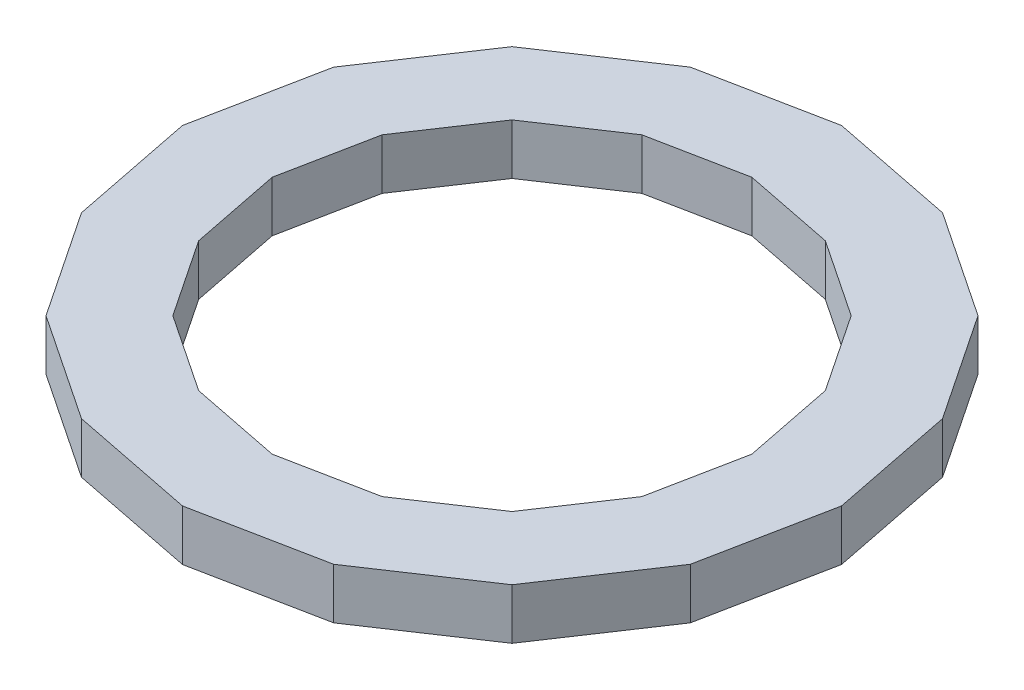
ISO-10303-21;
HEADER;
FILE_DESCRIPTION(('STEP AP214'),'2;1');
FILE_NAME('part.step','',(''),(''),'','','');
FILE_SCHEMA(('AUTOMOTIVE_DESIGN { 1 0 10303 214 1 1 1 1 }'));
ENDSEC;
DATA;
#1=APPLICATION_CONTEXT('core data for automotive mechanical design processes');
#2=APPLICATION_PROTOCOL_DEFINITION('international standard','automotive_design',2000,#1);
#3=PRODUCT_CONTEXT('',#1,'mechanical');
#4=PRODUCT('Part','Part','',(#3));
#5=PRODUCT_RELATED_PRODUCT_CATEGORY('part','',(#4));
#6=PRODUCT_DEFINITION_FORMATION('','',#4);
#7=PRODUCT_DEFINITION_CONTEXT('part definition',#1,'design');
#8=PRODUCT_DEFINITION('design','',#6,#7);
#9=PRODUCT_DEFINITION_SHAPE('','',#8);
#10=(LENGTH_UNIT() NAMED_UNIT(*) SI_UNIT(.MILLI.,.METRE.));
#11=(NAMED_UNIT(*) PLANE_ANGLE_UNIT() SI_UNIT($,.RADIAN.));
#12=(NAMED_UNIT(*) SI_UNIT($,.STERADIAN.) SOLID_ANGLE_UNIT());
#13=UNCERTAINTY_MEASURE_WITH_UNIT(LENGTH_MEASURE(1.E-05),#10,'distance_accuracy_value','');
#14=(GEOMETRIC_REPRESENTATION_CONTEXT(3) GLOBAL_UNCERTAINTY_ASSIGNED_CONTEXT((#13)) GLOBAL_UNIT_ASSIGNED_CONTEXT((#10,
#11,#12)) REPRESENTATION_CONTEXT('',''));
#15=CARTESIAN_POINT('',(0.,0.,0.));
#16=DIRECTION('',(0.,0.,1.));
#17=DIRECTION('',(1.,0.,0.));
#18=AXIS2_PLACEMENT_3D('',#15,#16,#17);
#19=CARTESIAN_POINT('',(0.,19.05,0.));
#20=DIRECTION('',(0.,1.,0.));
#21=DIRECTION('',(0.,0.,1.));
#22=AXIS2_PLACEMENT_3D('',#19,#20,#21);
#23=PLANE('',#22);
#24=DIRECTION('',(0.195090322016118,0.,-0.980785280403232));
#25=VECTOR('',#24,1.);
#26=CARTESIAN_POINT('',(114.271240567507,19.05,47.3326976322586));
#27=LINE('',#26,#25);
#28=CARTESIAN_POINT('',(114.271240567507,19.05,47.3326976322586));
#29=VERTEX_POINT('',#28);
#30=CARTESIAN_POINT('',(123.686299508005,19.05,-1.40512344733112E-12));
#31=VERTEX_POINT('',#30);
#32=EDGE_CURVE('E370',#29,#31,#27,.T.);
#33=ORIENTED_EDGE('',*,*,#32,.T.);
#34=DIRECTION('',(-0.195090322016139,0.,-0.980785280403228));
#35=VECTOR('',#34,1.);
#36=CARTESIAN_POINT('',(123.686299508005,19.05,-1.40512344733112E-12));
#37=LINE('',#36,#35);
#38=CARTESIAN_POINT('',(114.271240567506,19.05,-47.3326976322612));
#39=VERTEX_POINT('',#38);
#40=EDGE_CURVE('E373',#31,#39,#37,.T.);
#41=ORIENTED_EDGE('',*,*,#40,.T.);
#42=DIRECTION('',(-0.555570233019612,0.,-0.831469612302539));
#43=VECTOR('',#42,1.);
#44=CARTESIAN_POINT('',(114.271240567506,19.05,-47.3326976322612));
#45=LINE('',#44,#43);
#46=CARTESIAN_POINT('',(87.4594211219797,19.05,-87.4594211219817));
#47=VERTEX_POINT('',#46);
#48=EDGE_CURVE('E376',#39,#47,#45,.T.);
#49=ORIENTED_EDGE('',*,*,#48,.T.);
#50=DIRECTION('',(-0.831469612302551,0.,-0.555570233019593));
#51=VECTOR('',#50,1.);
#52=CARTESIAN_POINT('',(87.4594211219797,19.05,-87.4594211219817));
#53=LINE('',#52,#51);
#54=CARTESIAN_POINT('',(47.3326976322587,19.05,-114.271240567507));
#55=VERTEX_POINT('',#54);
#56=EDGE_CURVE('E378',#47,#55,#53,.T.);
#57=ORIENTED_EDGE('',*,*,#56,.T.);
#58=DIRECTION('',(-0.980785280403233,0.,-0.195090322016117));
#59=VECTOR('',#58,1.);
#60=CARTESIAN_POINT('',(47.3326976322587,19.05,-114.271240567507));
#61=LINE('',#60,#59);
#62=CARTESIAN_POINT('',(-1.45019229977314E-12,19.05,-123.686299508005));
#63=VERTEX_POINT('',#62);
#64=EDGE_CURVE('E380',#55,#63,#61,.T.);
#65=ORIENTED_EDGE('',*,*,#64,.T.);
#66=DIRECTION('',(-0.980785280403228,0.,0.195090322016139));
#67=VECTOR('',#66,1.);
#68=CARTESIAN_POINT('',(-1.45019229977314E-12,19.05,-123.686299508005));
#69=LINE('',#68,#67);
#70=CARTESIAN_POINT('',(-47.3326976322612,19.05,-114.271240567506));
#71=VERTEX_POINT('',#70);
#72=EDGE_CURVE('E382',#63,#71,#69,.T.);
#73=ORIENTED_EDGE('',*,*,#72,.T.);
#74=DIRECTION('',(-0.831469612302539,0.,0.555570233019612));
#75=VECTOR('',#74,1.);
#76=CARTESIAN_POINT('',(-47.3326976322612,19.05,-114.271240567506));
#77=LINE('',#76,#75);
#78=CARTESIAN_POINT('',(-87.4594211219816,19.05,-87.4594211219796));
#79=VERTEX_POINT('',#78);
#80=EDGE_CURVE('E384',#71,#79,#77,.T.);
#81=ORIENTED_EDGE('',*,*,#80,.T.);
#82=DIRECTION('',(-0.555570233019593,0.,0.831469612302551));
#83=VECTOR('',#82,1.);
#84=CARTESIAN_POINT('',(-87.4594211219816,19.05,-87.4594211219796));
#85=LINE('',#84,#83);
#86=CARTESIAN_POINT('',(-114.271240567507,19.05,-47.3326976322586));
#87=VERTEX_POINT('',#86);
#88=EDGE_CURVE('E386',#79,#87,#85,.T.);
#89=ORIENTED_EDGE('',*,*,#88,.T.);
#90=DIRECTION('',(-0.195090322016117,0.,0.980785280403233));
#91=VECTOR('',#90,1.);
#92=CARTESIAN_POINT('',(-114.271240567507,19.05,-47.3326976322586));
#93=LINE('',#92,#91);
#94=CARTESIAN_POINT('',(-123.686299508005,19.05,1.43584065974332E-12));
#95=VERTEX_POINT('',#94);
#96=EDGE_CURVE('E389',#87,#95,#93,.T.);
#97=ORIENTED_EDGE('',*,*,#96,.T.);
#98=DIRECTION('',(0.195090322016139,0.,0.980785280403228));
#99=VECTOR('',#98,1.);
#100=CARTESIAN_POINT('',(-123.686299508005,19.05,1.43584065974332E-12));
#101=LINE('',#100,#99);
#102=CARTESIAN_POINT('',(-114.271240567506,19.05,47.3326976322612));
#103=VERTEX_POINT('',#102);
#104=EDGE_CURVE('E391',#95,#103,#101,.T.);
#105=ORIENTED_EDGE('',*,*,#104,.T.);
#106=DIRECTION('',(0.555570233019612,0.,0.831469612302539));
#107=VECTOR('',#106,1.);
#108=CARTESIAN_POINT('',(-114.271240567506,19.05,47.3326976322612));
#109=LINE('',#108,#107);
#110=CARTESIAN_POINT('',(-87.4594211219797,19.05,87.4594211219816));
#111=VERTEX_POINT('',#110);
#112=EDGE_CURVE('E393',#103,#111,#109,.T.);
#113=ORIENTED_EDGE('',*,*,#112,.T.);
#114=DIRECTION('',(0.831469612302552,0.,0.555570233019593));
#115=VECTOR('',#114,1.);
#116=CARTESIAN_POINT('',(-87.4594211219797,19.05,87.4594211219816));
#117=LINE('',#116,#115);
#118=CARTESIAN_POINT('',(-47.3326976322585,19.05,114.271240567507));
#119=VERTEX_POINT('',#118);
#120=EDGE_CURVE('E396',#111,#119,#117,.T.);
#121=ORIENTED_EDGE('',*,*,#120,.T.);
#122=DIRECTION('',(0.980785280403233,0.,0.195090322016117));
#123=VECTOR('',#122,1.);
#124=CARTESIAN_POINT('',(-47.3326976322585,19.05,114.271240567507));
#125=LINE('',#124,#123);
#126=CARTESIAN_POINT('',(1.37953051063682E-12,19.05,123.686299508005));
#127=VERTEX_POINT('',#126);
#128=EDGE_CURVE('E399',#119,#127,#125,.T.);
#129=ORIENTED_EDGE('',*,*,#128,.T.);
#130=DIRECTION('',(0.980785280403228,0.,-0.195090322016139));
#131=VECTOR('',#130,1.);
#132=CARTESIAN_POINT('',(1.37953051063682E-12,19.05,123.686299508005));
#133=LINE('',#132,#131);
#134=CARTESIAN_POINT('',(47.3326976322611,19.05,114.271240567506));
#135=VERTEX_POINT('',#134);
#136=EDGE_CURVE('E401',#127,#135,#133,.T.);
#137=ORIENTED_EDGE('',*,*,#136,.T.);
#138=DIRECTION('',(0.831469612302539,0.,-0.555570233019612));
#139=VECTOR('',#138,1.);
#140=CARTESIAN_POINT('',(47.3326976322611,19.05,114.271240567506));
#141=LINE('',#140,#139);
#142=CARTESIAN_POINT('',(87.4594211219816,19.05,87.4594211219797));
#143=VERTEX_POINT('',#142);
#144=EDGE_CURVE('E404',#135,#143,#141,.T.);
#145=ORIENTED_EDGE('',*,*,#144,.T.);
#146=DIRECTION('',(0.555570233019593,0.,-0.831469612302551));
#147=VECTOR('',#146,1.);
#148=CARTESIAN_POINT('',(87.4594211219816,19.05,87.4594211219797));
#149=LINE('',#148,#147);
#150=EDGE_CURVE('E407',#143,#29,#149,.T.);
#151=ORIENTED_EDGE('',*,*,#150,.T.);
#152=EDGE_LOOP('',(#33,#41,#49,#57,#65,#73,#81,#89,#97,#105,#113,#121,#129,#137,#145,#151));
#153=FACE_BOUND('',#152,.T.);
#154=DIRECTION('',(-0.195090322016139,0.,-0.980785280403228));
#155=VECTOR('',#154,1.);
#156=CARTESIAN_POINT('',(90.0193994639663,19.05,-1.03392254762578E-12));
#157=LINE('',#156,#155);
#158=CARTESIAN_POINT('',(90.0193994639663,19.05,-1.03392254762578E-12));
#159=VERTEX_POINT('',#158);
#160=CARTESIAN_POINT('',(83.1670806937156,19.05,-34.4489327663157));
#161=VERTEX_POINT('',#160);
#162=EDGE_CURVE('E252',#159,#161,#157,.T.);
#163=ORIENTED_EDGE('',*,*,#162,.F.);
#164=DIRECTION('',(0.195090322016117,0.,-0.980785280403233));
#165=VECTOR('',#164,1.);
#166=CARTESIAN_POINT('',(83.1670806937164,19.05,34.4489327663138));
#167=LINE('',#166,#165);
#168=CARTESIAN_POINT('',(83.1670806937164,19.05,34.4489327663138));
#169=VERTEX_POINT('',#168);
#170=EDGE_CURVE('E243',#169,#159,#167,.T.);
#171=ORIENTED_EDGE('',*,*,#170,.F.);
#172=DIRECTION('',(0.555570233019593,0.,-0.831469612302552));
#173=VECTOR('',#172,1.);
#174=CARTESIAN_POINT('',(63.653327799312,19.05,63.6533277993105));
#175=LINE('',#174,#173);
#176=CARTESIAN_POINT('',(63.653327799312,19.05,63.6533277993105));
#177=VERTEX_POINT('',#176);
#178=EDGE_CURVE('E295',#177,#169,#175,.T.);
#179=ORIENTED_EDGE('',*,*,#178,.F.);
#180=DIRECTION('',(0.831469612302539,0.,-0.555570233019612));
#181=VECTOR('',#180,1.);
#182=CARTESIAN_POINT('',(34.4489327663157,19.05,83.1670806937156));
#183=LINE('',#182,#181);
#184=CARTESIAN_POINT('',(34.4489327663157,19.05,83.1670806937156));
#185=VERTEX_POINT('',#184);
#186=EDGE_CURVE('E293',#185,#177,#183,.T.);
#187=ORIENTED_EDGE('',*,*,#186,.F.);
#188=DIRECTION('',(0.980785280403228,0.,-0.19509032201614));
#189=VECTOR('',#188,1.);
#190=CARTESIAN_POINT('',(9.94426697695727E-13,19.05,90.0193994639663));
#191=LINE('',#190,#189);
#192=CARTESIAN_POINT('',(9.94426697695727E-13,19.05,90.0193994639663));
#193=VERTEX_POINT('',#192);
#194=EDGE_CURVE('E291',#193,#185,#191,.T.);
#195=ORIENTED_EDGE('',*,*,#194,.F.);
#196=DIRECTION('',(0.980785280403233,0.,0.195090322016117));
#197=VECTOR('',#196,1.);
#198=CARTESIAN_POINT('',(-34.4489327663138,19.05,83.1670806937164));
#199=LINE('',#198,#197);
#200=CARTESIAN_POINT('',(-34.4489327663138,19.05,83.1670806937164));
#201=VERTEX_POINT('',#200);
#202=EDGE_CURVE('E289',#201,#193,#199,.T.);
#203=ORIENTED_EDGE('',*,*,#202,.F.);
#204=DIRECTION('',(0.831469612302551,0.,0.555570233019593));
#205=VECTOR('',#204,1.);
#206=CARTESIAN_POINT('',(-63.6533277993105,19.05,63.653327799312));
#207=LINE('',#206,#205);
#208=CARTESIAN_POINT('',(-63.6533277993105,19.05,63.653327799312));
#209=VERTEX_POINT('',#208);
#210=EDGE_CURVE('E287',#209,#201,#207,.T.);
#211=ORIENTED_EDGE('',*,*,#210,.F.);
#212=DIRECTION('',(0.555570233019612,0.,0.831469612302539));
#213=VECTOR('',#212,1.);
#214=CARTESIAN_POINT('',(-83.1670806937156,19.05,34.4489327663157));
#215=LINE('',#214,#213);
#216=CARTESIAN_POINT('',(-83.1670806937156,19.05,34.4489327663157));
#217=VERTEX_POINT('',#216);
#218=EDGE_CURVE('E285',#217,#209,#215,.T.);
#219=ORIENTED_EDGE('',*,*,#218,.F.);
#220=DIRECTION('',(0.195090322016139,0.,0.980785280403228));
#221=VECTOR('',#220,1.);
#222=CARTESIAN_POINT('',(-90.0193994639663,19.05,1.01994808380553E-12));
#223=LINE('',#222,#221);
#224=CARTESIAN_POINT('',(-90.0193994639663,19.05,1.01994808380553E-12));
#225=VERTEX_POINT('',#224);
#226=EDGE_CURVE('E283',#225,#217,#223,.T.);
#227=ORIENTED_EDGE('',*,*,#226,.F.);
#228=DIRECTION('',(-0.195090322016117,0.,0.980785280403233));
#229=VECTOR('',#228,1.);
#230=CARTESIAN_POINT('',(-83.1670806937164,19.05,-34.4489327663138));
#231=LINE('',#230,#229);
#232=CARTESIAN_POINT('',(-83.1670806937164,19.05,-34.4489327663138));
#233=VERTEX_POINT('',#232);
#234=EDGE_CURVE('E280',#233,#225,#231,.T.);
#235=ORIENTED_EDGE('',*,*,#234,.F.);
#236=DIRECTION('',(-0.555570233019592,0.,0.831469612302552));
#237=VECTOR('',#236,1.);
#238=CARTESIAN_POINT('',(-63.653327799312,19.05,-63.6533277993105));
#239=LINE('',#238,#237);
#240=CARTESIAN_POINT('',(-63.653327799312,19.05,-63.6533277993105));
#241=VERTEX_POINT('',#240);
#242=EDGE_CURVE('E277',#241,#233,#239,.T.);
#243=ORIENTED_EDGE('',*,*,#242,.F.);
#244=DIRECTION('',(-0.831469612302539,0.,0.555570233019612));
#245=VECTOR('',#244,1.);
#246=CARTESIAN_POINT('',(-34.4489327663157,19.05,-83.1670806937156));
#247=LINE('',#246,#245);
#248=CARTESIAN_POINT('',(-34.4489327663157,19.05,-83.1670806937156));
#249=VERTEX_POINT('',#248);
#250=EDGE_CURVE('E275',#249,#241,#247,.T.);
#251=ORIENTED_EDGE('',*,*,#250,.F.);
#252=DIRECTION('',(-0.980785280403228,0.,0.19509032201614));
#253=VECTOR('',#252,1.);
#254=CARTESIAN_POINT('',(-1.08225444788511E-12,19.05,-90.0193994639663));
#255=LINE('',#254,#253);
#256=CARTESIAN_POINT('',(-1.08225444788511E-12,19.05,-90.0193994639663));
#257=VERTEX_POINT('',#256);
#258=EDGE_CURVE('E273',#257,#249,#255,.T.);
#259=ORIENTED_EDGE('',*,*,#258,.F.);
#260=DIRECTION('',(-0.980785280403233,0.,-0.195090322016117));
#261=VECTOR('',#260,1.);
#262=CARTESIAN_POINT('',(34.4489327663137,19.05,-83.1670806937164));
#263=LINE('',#262,#261);
#264=CARTESIAN_POINT('',(34.4489327663137,19.05,-83.1670806937164));
#265=VERTEX_POINT('',#264);
#266=EDGE_CURVE('E271',#265,#257,#263,.T.);
#267=ORIENTED_EDGE('',*,*,#266,.F.);
#268=DIRECTION('',(-0.831469612302552,0.,-0.555570233019593));
#269=VECTOR('',#268,1.);
#270=CARTESIAN_POINT('',(63.6533277993105,19.05,-63.6533277993119));
#271=LINE('',#270,#269);
#272=CARTESIAN_POINT('',(63.6533277993105,19.05,-63.6533277993119));
#273=VERTEX_POINT('',#272);
#274=EDGE_CURVE('E267',#273,#265,#271,.T.);
#275=ORIENTED_EDGE('',*,*,#274,.F.);
#276=DIRECTION('',(-0.555570233019612,0.,-0.831469612302538));
#277=VECTOR('',#276,1.);
#278=CARTESIAN_POINT('',(83.1670806937156,19.05,-34.4489327663157));
#279=LINE('',#278,#277);
#280=EDGE_CURVE('E265',#161,#273,#279,.T.);
#281=ORIENTED_EDGE('',*,*,#280,.F.);
#282=EDGE_LOOP('',(#163,#171,#179,#187,#195,#203,#211,#219,#227,#235,#243,#251,#259,#267,#275,#281));
#283=FACE_BOUND('',#282,.T.);
#284=ADVANCED_FACE('F34',(#153,#283),#23,.T.);
#285=CARTESIAN_POINT('',(0.,0.,0.));
#286=DIRECTION('',(0.,1.,0.));
#287=DIRECTION('',(0.,0.,1.));
#288=AXIS2_PLACEMENT_3D('',#285,#286,#287);
#289=PLANE('',#288);
#290=DIRECTION('',(0.195090322016118,0.,-0.980785280403232));
#291=VECTOR('',#290,1.);
#292=CARTESIAN_POINT('',(114.271240567507,0.,47.3326976322586));
#293=LINE('',#292,#291);
#294=CARTESIAN_POINT('',(114.271240567507,0.,47.3326976322586));
#295=VERTEX_POINT('',#294);
#296=CARTESIAN_POINT('',(123.686299508005,0.,-1.40512344733112E-12));
#297=VERTEX_POINT('',#296);
#298=EDGE_CURVE('E260',#295,#297,#293,.T.);
#299=ORIENTED_EDGE('',*,*,#298,.F.);
#300=DIRECTION('',(0.555570233019593,0.,-0.831469612302551));
#301=VECTOR('',#300,1.);
#302=CARTESIAN_POINT('',(87.4594211219816,0.,87.4594211219797));
#303=LINE('',#302,#301);
#304=CARTESIAN_POINT('',(87.4594211219816,0.,87.4594211219797));
#305=VERTEX_POINT('',#304);
#306=EDGE_CURVE('E374',#305,#295,#303,.T.);
#307=ORIENTED_EDGE('',*,*,#306,.F.);
#308=DIRECTION('',(0.831469612302539,0.,-0.555570233019612));
#309=VECTOR('',#308,1.);
#310=CARTESIAN_POINT('',(47.3326976322611,0.,114.271240567506));
#311=LINE('',#310,#309);
#312=CARTESIAN_POINT('',(47.3326976322611,0.,114.271240567506));
#313=VERTEX_POINT('',#312);
#314=EDGE_CURVE('E443',#313,#305,#311,.T.);
#315=ORIENTED_EDGE('',*,*,#314,.F.);
#316=DIRECTION('',(0.980785280403228,0.,-0.195090322016139));
#317=VECTOR('',#316,1.);
#318=CARTESIAN_POINT('',(1.37953051063682E-12,0.,123.686299508005));
#319=LINE('',#318,#317);
#320=CARTESIAN_POINT('',(1.37953051063682E-12,0.,123.686299508005));
#321=VERTEX_POINT('',#320);
#322=EDGE_CURVE('E440',#321,#313,#319,.T.);
#323=ORIENTED_EDGE('',*,*,#322,.F.);
#324=DIRECTION('',(0.980785280403233,0.,0.195090322016117));
#325=VECTOR('',#324,1.);
#326=CARTESIAN_POINT('',(-47.3326976322585,0.,114.271240567507));
#327=LINE('',#326,#325);
#328=CARTESIAN_POINT('',(-47.3326976322585,0.,114.271240567507));
#329=VERTEX_POINT('',#328);
#330=EDGE_CURVE('E437',#329,#321,#327,.T.);
#331=ORIENTED_EDGE('',*,*,#330,.F.);
#332=DIRECTION('',(0.831469612302552,0.,0.555570233019593));
#333=VECTOR('',#332,1.);
#334=CARTESIAN_POINT('',(-87.4594211219797,0.,87.4594211219816));
#335=LINE('',#334,#333);
#336=CARTESIAN_POINT('',(-87.4594211219797,0.,87.4594211219816));
#337=VERTEX_POINT('',#336);
#338=EDGE_CURVE('E434',#337,#329,#335,.T.);
#339=ORIENTED_EDGE('',*,*,#338,.F.);
#340=DIRECTION('',(0.555570233019612,0.,0.831469612302539));
#341=VECTOR('',#340,1.);
#342=CARTESIAN_POINT('',(-114.271240567506,0.,47.3326976322612));
#343=LINE('',#342,#341);
#344=CARTESIAN_POINT('',(-114.271240567506,0.,47.3326976322612));
#345=VERTEX_POINT('',#344);
#346=EDGE_CURVE('E431',#345,#337,#343,.T.);
#347=ORIENTED_EDGE('',*,*,#346,.F.);
#348=DIRECTION('',(0.195090322016139,0.,0.980785280403228));
#349=VECTOR('',#348,1.);
#350=CARTESIAN_POINT('',(-123.686299508005,0.,1.43584065974332E-12));
#351=LINE('',#350,#349);
#352=CARTESIAN_POINT('',(-123.686299508005,0.,1.43584065974332E-12));
#353=VERTEX_POINT('',#352);
#354=EDGE_CURVE('E428',#353,#345,#351,.T.);
#355=ORIENTED_EDGE('',*,*,#354,.F.);
#356=DIRECTION('',(-0.195090322016117,0.,0.980785280403233));
#357=VECTOR('',#356,1.);
#358=CARTESIAN_POINT('',(-114.271240567507,0.,-47.3326976322586));
#359=LINE('',#358,#357);
#360=CARTESIAN_POINT('',(-114.271240567507,0.,-47.3326976322586));
#361=VERTEX_POINT('',#360);
#362=EDGE_CURVE('E426',#361,#353,#359,.T.);
#363=ORIENTED_EDGE('',*,*,#362,.F.);
#364=DIRECTION('',(-0.555570233019593,0.,0.831469612302551));
#365=VECTOR('',#364,1.);
#366=CARTESIAN_POINT('',(-87.4594211219816,0.,-87.4594211219796));
#367=LINE('',#366,#365);
#368=CARTESIAN_POINT('',(-87.4594211219816,0.,-87.4594211219796));
#369=VERTEX_POINT('',#368);
#370=EDGE_CURVE('E424',#369,#361,#367,.T.);
#371=ORIENTED_EDGE('',*,*,#370,.F.);
#372=DIRECTION('',(-0.831469612302539,0.,0.555570233019612));
#373=VECTOR('',#372,1.);
#374=CARTESIAN_POINT('',(-47.3326976322612,0.,-114.271240567506));
#375=LINE('',#374,#373);
#376=CARTESIAN_POINT('',(-47.3326976322612,0.,-114.271240567506));
#377=VERTEX_POINT('',#376);
#378=EDGE_CURVE('E422',#377,#369,#375,.T.);
#379=ORIENTED_EDGE('',*,*,#378,.F.);
#380=DIRECTION('',(-0.980785280403228,0.,0.195090322016139));
#381=VECTOR('',#380,1.);
#382=CARTESIAN_POINT('',(-1.45019229977314E-12,0.,-123.686299508005));
#383=LINE('',#382,#381);
#384=CARTESIAN_POINT('',(-1.45019229977314E-12,0.,-123.686299508005));
#385=VERTEX_POINT('',#384);
#386=EDGE_CURVE('E420',#385,#377,#383,.T.);
#387=ORIENTED_EDGE('',*,*,#386,.F.);
#388=DIRECTION('',(-0.980785280403233,0.,-0.195090322016117));
#389=VECTOR('',#388,1.);
#390=CARTESIAN_POINT('',(47.3326976322587,0.,-114.271240567507));
#391=LINE('',#390,#389);
#392=CARTESIAN_POINT('',(47.3326976322587,0.,-114.271240567507));
#393=VERTEX_POINT('',#392);
#394=EDGE_CURVE('E418',#393,#385,#391,.T.);
#395=ORIENTED_EDGE('',*,*,#394,.F.);
#396=DIRECTION('',(-0.831469612302551,0.,-0.555570233019593));
#397=VECTOR('',#396,1.);
#398=CARTESIAN_POINT('',(87.4594211219797,0.,-87.4594211219817));
#399=LINE('',#398,#397);
#400=CARTESIAN_POINT('',(87.4594211219797,0.,-87.4594211219817));
#401=VERTEX_POINT('',#400);
#402=EDGE_CURVE('E416',#401,#393,#399,.T.);
#403=ORIENTED_EDGE('',*,*,#402,.F.);
#404=DIRECTION('',(-0.555570233019612,0.,-0.831469612302539));
#405=VECTOR('',#404,1.);
#406=CARTESIAN_POINT('',(114.271240567506,0.,-47.3326976322612));
#407=LINE('',#406,#405);
#408=CARTESIAN_POINT('',(114.271240567506,0.,-47.3326976322612));
#409=VERTEX_POINT('',#408);
#410=EDGE_CURVE('E414',#409,#401,#407,.T.);
#411=ORIENTED_EDGE('',*,*,#410,.F.);
#412=DIRECTION('',(-0.195090322016139,0.,-0.980785280403228));
#413=VECTOR('',#412,1.);
#414=CARTESIAN_POINT('',(123.686299508005,0.,-1.40512344733112E-12));
#415=LINE('',#414,#413);
#416=EDGE_CURVE('E412',#297,#409,#415,.T.);
#417=ORIENTED_EDGE('',*,*,#416,.F.);
#418=EDGE_LOOP('',(#299,#307,#315,#323,#331,#339,#347,#355,#363,#371,#379,#387,#395,#403,#411,#417));
#419=FACE_BOUND('',#418,.T.);
#420=DIRECTION('',(0.195090322016117,0.,-0.980785280403233));
#421=VECTOR('',#420,1.);
#422=CARTESIAN_POINT('',(83.1670806937164,0.,34.4489327663138));
#423=LINE('',#422,#421);
#424=CARTESIAN_POINT('',(83.1670806937164,0.,34.4489327663138));
#425=VERTEX_POINT('',#424);
#426=CARTESIAN_POINT('',(90.0193994639663,0.,-1.03392254762578E-12));
#427=VERTEX_POINT('',#426);
#428=EDGE_CURVE('E57',#425,#427,#423,.T.);
#429=ORIENTED_EDGE('',*,*,#428,.T.);
#430=DIRECTION('',(-0.195090322016139,0.,-0.980785280403228));
#431=VECTOR('',#430,1.);
#432=CARTESIAN_POINT('',(90.0193994639663,0.,-1.03392254762578E-12));
#433=LINE('',#432,#431);
#434=CARTESIAN_POINT('',(83.1670806937156,0.,-34.4489327663157));
#435=VERTEX_POINT('',#434);
#436=EDGE_CURVE('E259',#427,#435,#433,.T.);
#437=ORIENTED_EDGE('',*,*,#436,.T.);
#438=DIRECTION('',(-0.555570233019612,0.,-0.831469612302538));
#439=VECTOR('',#438,1.);
#440=CARTESIAN_POINT('',(83.1670806937156,0.,-34.4489327663157));
#441=LINE('',#440,#439);
#442=CARTESIAN_POINT('',(63.6533277993105,0.,-63.6533277993119));
#443=VERTEX_POINT('',#442);
#444=EDGE_CURVE('E299',#435,#443,#441,.T.);
#445=ORIENTED_EDGE('',*,*,#444,.T.);
#446=DIRECTION('',(-0.831469612302552,0.,-0.555570233019593));
#447=VECTOR('',#446,1.);
#448=CARTESIAN_POINT('',(63.6533277993105,0.,-63.6533277993119));
#449=LINE('',#448,#447);
#450=CARTESIAN_POINT('',(34.4489327663137,0.,-83.1670806937164));
#451=VERTEX_POINT('',#450);
#452=EDGE_CURVE('E302',#443,#451,#449,.T.);
#453=ORIENTED_EDGE('',*,*,#452,.T.);
#454=DIRECTION('',(-0.980785280403233,0.,-0.195090322016117));
#455=VECTOR('',#454,1.);
#456=CARTESIAN_POINT('',(34.4489327663137,0.,-83.1670806937164));
#457=LINE('',#456,#455);
#458=CARTESIAN_POINT('',(-1.08225444788511E-12,0.,-90.0193994639663));
#459=VERTEX_POINT('',#458);
#460=EDGE_CURVE('E305',#451,#459,#457,.T.);
#461=ORIENTED_EDGE('',*,*,#460,.T.);
#462=DIRECTION('',(-0.980785280403228,0.,0.19509032201614));
#463=VECTOR('',#462,1.);
#464=CARTESIAN_POINT('',(-1.08225444788511E-12,0.,-90.0193994639663));
#465=LINE('',#464,#463);
#466=CARTESIAN_POINT('',(-34.4489327663157,0.,-83.1670806937156));
#467=VERTEX_POINT('',#466);
#468=EDGE_CURVE('E308',#459,#467,#465,.T.);
#469=ORIENTED_EDGE('',*,*,#468,.T.);
#470=DIRECTION('',(-0.831469612302539,0.,0.555570233019612));
#471=VECTOR('',#470,1.);
#472=CARTESIAN_POINT('',(-34.4489327663157,0.,-83.1670806937156));
#473=LINE('',#472,#471);
#474=CARTESIAN_POINT('',(-63.653327799312,0.,-63.6533277993105));
#475=VERTEX_POINT('',#474);
#476=EDGE_CURVE('E311',#467,#475,#473,.T.);
#477=ORIENTED_EDGE('',*,*,#476,.T.);
#478=DIRECTION('',(-0.555570233019592,0.,0.831469612302552));
#479=VECTOR('',#478,1.);
#480=CARTESIAN_POINT('',(-63.653327799312,0.,-63.6533277993105));
#481=LINE('',#480,#479);
#482=CARTESIAN_POINT('',(-83.1670806937164,0.,-34.4489327663138));
#483=VERTEX_POINT('',#482);
#484=EDGE_CURVE('E314',#475,#483,#481,.T.);
#485=ORIENTED_EDGE('',*,*,#484,.T.);
#486=DIRECTION('',(-0.195090322016117,0.,0.980785280403233));
#487=VECTOR('',#486,1.);
#488=CARTESIAN_POINT('',(-83.1670806937164,0.,-34.4489327663138));
#489=LINE('',#488,#487);
#490=CARTESIAN_POINT('',(-90.0193994639663,0.,1.01994808380553E-12));
#491=VERTEX_POINT('',#490);
#492=EDGE_CURVE('E317',#483,#491,#489,.T.);
#493=ORIENTED_EDGE('',*,*,#492,.T.);
#494=DIRECTION('',(0.195090322016139,0.,0.980785280403228));
#495=VECTOR('',#494,1.);
#496=CARTESIAN_POINT('',(-90.0193994639663,0.,1.01994808380553E-12));
#497=LINE('',#496,#495);
#498=CARTESIAN_POINT('',(-83.1670806937156,0.,34.4489327663157));
#499=VERTEX_POINT('',#498);
#500=EDGE_CURVE('E321',#491,#499,#497,.T.);
#501=ORIENTED_EDGE('',*,*,#500,.T.);
#502=DIRECTION('',(0.555570233019612,0.,0.831469612302539));
#503=VECTOR('',#502,1.);
#504=CARTESIAN_POINT('',(-83.1670806937156,0.,34.4489327663157));
#505=LINE('',#504,#503);
#506=CARTESIAN_POINT('',(-63.6533277993105,0.,63.653327799312));
#507=VERTEX_POINT('',#506);
#508=EDGE_CURVE('E324',#499,#507,#505,.T.);
#509=ORIENTED_EDGE('',*,*,#508,.T.);
#510=DIRECTION('',(0.831469612302551,0.,0.555570233019593));
#511=VECTOR('',#510,1.);
#512=CARTESIAN_POINT('',(-63.6533277993105,0.,63.653327799312));
#513=LINE('',#512,#511);
#514=CARTESIAN_POINT('',(-34.4489327663138,0.,83.1670806937164));
#515=VERTEX_POINT('',#514);
#516=EDGE_CURVE('E327',#507,#515,#513,.T.);
#517=ORIENTED_EDGE('',*,*,#516,.T.);
#518=DIRECTION('',(0.980785280403233,0.,0.195090322016117));
#519=VECTOR('',#518,1.);
#520=CARTESIAN_POINT('',(-34.4489327663138,0.,83.1670806937164));
#521=LINE('',#520,#519);
#522=CARTESIAN_POINT('',(9.94426697695727E-13,0.,90.0193994639663));
#523=VERTEX_POINT('',#522);
#524=EDGE_CURVE('E330',#515,#523,#521,.T.);
#525=ORIENTED_EDGE('',*,*,#524,.T.);
#526=DIRECTION('',(0.980785280403228,0.,-0.19509032201614));
#527=VECTOR('',#526,1.);
#528=CARTESIAN_POINT('',(9.94426697695727E-13,0.,90.0193994639663));
#529=LINE('',#528,#527);
#530=CARTESIAN_POINT('',(34.4489327663157,0.,83.1670806937156));
#531=VERTEX_POINT('',#530);
#532=EDGE_CURVE('E333',#523,#531,#529,.T.);
#533=ORIENTED_EDGE('',*,*,#532,.T.);
#534=DIRECTION('',(0.831469612302539,0.,-0.555570233019612));
#535=VECTOR('',#534,1.);
#536=CARTESIAN_POINT('',(34.4489327663157,0.,83.1670806937156));
#537=LINE('',#536,#535);
#538=CARTESIAN_POINT('',(63.653327799312,0.,63.6533277993105));
#539=VERTEX_POINT('',#538);
#540=EDGE_CURVE('E336',#531,#539,#537,.T.);
#541=ORIENTED_EDGE('',*,*,#540,.T.);
#542=DIRECTION('',(0.555570233019593,0.,-0.831469612302552));
#543=VECTOR('',#542,1.);
#544=CARTESIAN_POINT('',(63.653327799312,0.,63.6533277993105));
#545=LINE('',#544,#543);
#546=EDGE_CURVE('E253',#539,#425,#545,.T.);
#547=ORIENTED_EDGE('',*,*,#546,.T.);
#548=EDGE_LOOP('',(#429,#437,#445,#453,#461,#469,#477,#485,#493,#501,#509,#517,#525,#533,#541,#547));
#549=FACE_BOUND('',#548,.T.);
#550=ADVANCED_FACE('F502',(#419,#549),#289,.F.);
#551=CARTESIAN_POINT('',(114.271240567507,19.05,47.3326976322586));
#552=DIRECTION('',(-0.980785280403233,0.,-0.195090322016118));
#553=DIRECTION('',(-0.195090322016118,0.,0.980785280403233));
#554=AXIS2_PLACEMENT_3D('',#551,#552,#553);
#555=PLANE('',#554);
#556=ORIENTED_EDGE('',*,*,#298,.T.);
#557=DIRECTION('',(0.,-1.,0.));
#558=VECTOR('',#557,1.);
#559=CARTESIAN_POINT('',(123.686299508005,19.05,-1.40512344733112E-12));
#560=LINE('',#559,#558);
#561=EDGE_CURVE('E11',#31,#297,#560,.T.);
#562=ORIENTED_EDGE('',*,*,#561,.F.);
#563=ORIENTED_EDGE('',*,*,#32,.F.);
#564=DIRECTION('',(0.,-1.,0.));
#565=VECTOR('',#564,1.);
#566=CARTESIAN_POINT('',(114.271240567507,19.05,47.3326976322586));
#567=LINE('',#566,#565);
#568=EDGE_CURVE('E409',#29,#295,#567,.T.);
#569=ORIENTED_EDGE('',*,*,#568,.T.);
#570=EDGE_LOOP('',(#556,#562,#563,#569));
#571=FACE_BOUND('',#570,.T.);
#572=ADVANCED_FACE('F36',(#571),#555,.F.);
#573=CARTESIAN_POINT('',(123.686299508005,19.05,-1.40512344733112E-12));
#574=DIRECTION('',(-0.980785280403228,0.,0.195090322016139));
#575=DIRECTION('',(0.195090322016139,0.,0.980785280403228));
#576=AXIS2_PLACEMENT_3D('',#573,#574,#575);
#577=PLANE('',#576);
#578=ORIENTED_EDGE('',*,*,#416,.T.);
#579=DIRECTION('',(0.,-1.,0.));
#580=VECTOR('',#579,1.);
#581=CARTESIAN_POINT('',(114.271240567506,19.05,-47.3326976322612));
#582=LINE('',#581,#580);
#583=EDGE_CURVE('E42',#39,#409,#582,.T.);
#584=ORIENTED_EDGE('',*,*,#583,.F.);
#585=ORIENTED_EDGE('',*,*,#40,.F.);
#586=ORIENTED_EDGE('',*,*,#561,.T.);
#587=EDGE_LOOP('',(#578,#584,#585,#586));
#588=FACE_BOUND('',#587,.T.);
#589=ADVANCED_FACE('F519',(#588),#577,.F.);
#590=CARTESIAN_POINT('',(114.271240567506,19.05,-47.3326976322612));
#591=DIRECTION('',(-0.831469612302539,0.,0.555570233019612));
#592=DIRECTION('',(0.555570233019612,0.,0.831469612302539));
#593=AXIS2_PLACEMENT_3D('',#590,#591,#592);
#594=PLANE('',#593);
#595=ORIENTED_EDGE('',*,*,#410,.T.);
#596=DIRECTION('',(0.,-1.,0.));
#597=VECTOR('',#596,1.);
#598=CARTESIAN_POINT('',(87.4594211219797,19.05,-87.4594211219817));
#599=LINE('',#598,#597);
#600=EDGE_CURVE('E489',#47,#401,#599,.T.);
#601=ORIENTED_EDGE('',*,*,#600,.F.);
#602=ORIENTED_EDGE('',*,*,#48,.F.);
#603=ORIENTED_EDGE('',*,*,#583,.T.);
#604=EDGE_LOOP('',(#595,#601,#602,#603));
#605=FACE_BOUND('',#604,.T.);
#606=ADVANCED_FACE('F496',(#605),#594,.F.);
#607=CARTESIAN_POINT('',(87.4594211219797,19.05,-87.4594211219817));
#608=DIRECTION('',(-0.555570233019593,0.,0.831469612302551));
#609=DIRECTION('',(0.831469612302552,0.,0.555570233019593));
#610=AXIS2_PLACEMENT_3D('',#607,#608,#609);
#611=PLANE('',#610);
#612=ORIENTED_EDGE('',*,*,#402,.T.);
#613=DIRECTION('',(0.,-1.,0.));
#614=VECTOR('',#613,1.);
#615=CARTESIAN_POINT('',(47.3326976322587,19.05,-114.271240567507));
#616=LINE('',#615,#614);
#617=EDGE_CURVE('E485',#55,#393,#616,.T.);
#618=ORIENTED_EDGE('',*,*,#617,.F.);
#619=ORIENTED_EDGE('',*,*,#56,.F.);
#620=ORIENTED_EDGE('',*,*,#600,.T.);
#621=EDGE_LOOP('',(#612,#618,#619,#620));
#622=FACE_BOUND('',#621,.T.);
#623=ADVANCED_FACE('F508',(#622),#611,.F.);
#624=CARTESIAN_POINT('',(47.3326976322587,19.05,-114.271240567507));
#625=DIRECTION('',(-0.195090322016117,0.,0.980785280403233));
#626=DIRECTION('',(0.980785280403233,0.,0.195090322016117));
#627=AXIS2_PLACEMENT_3D('',#624,#625,#626);
#628=PLANE('',#627);
#629=ORIENTED_EDGE('',*,*,#394,.T.);
#630=DIRECTION('',(0.,-1.,0.));
#631=VECTOR('',#630,1.);
#632=CARTESIAN_POINT('',(-1.45019229977314E-12,19.05,-123.686299508005));
#633=LINE('',#632,#631);
#634=EDGE_CURVE('E482',#63,#385,#633,.T.);
#635=ORIENTED_EDGE('',*,*,#634,.F.);
#636=ORIENTED_EDGE('',*,*,#64,.F.);
#637=ORIENTED_EDGE('',*,*,#617,.T.);
#638=EDGE_LOOP('',(#629,#635,#636,#637));
#639=FACE_BOUND('',#638,.T.);
#640=ADVANCED_FACE('F512',(#639),#628,.F.);
#641=CARTESIAN_POINT('',(-1.45019229977314E-12,19.05,-123.686299508005));
#642=DIRECTION('',(0.195090322016139,0.,0.980785280403228));
#643=DIRECTION('',(0.980785280403228,0.,-0.195090322016139));
#644=AXIS2_PLACEMENT_3D('',#641,#642,#643);
#645=PLANE('',#644);
#646=ORIENTED_EDGE('',*,*,#386,.T.);
#647=DIRECTION('',(0.,-1.,0.));
#648=VECTOR('',#647,1.);
#649=CARTESIAN_POINT('',(-47.3326976322612,19.05,-114.271240567506));
#650=LINE('',#649,#648);
#651=EDGE_CURVE('E478',#71,#377,#650,.T.);
#652=ORIENTED_EDGE('',*,*,#651,.F.);
#653=ORIENTED_EDGE('',*,*,#72,.F.);
#654=ORIENTED_EDGE('',*,*,#634,.T.);
#655=EDGE_LOOP('',(#646,#652,#653,#654));
#656=FACE_BOUND('',#655,.T.);
#657=ADVANCED_FACE('F572',(#656),#645,.F.);
#658=CARTESIAN_POINT('',(-47.3326976322612,19.05,-114.271240567506));
#659=DIRECTION('',(0.555570233019612,0.,0.831469612302539));
#660=DIRECTION('',(0.831469612302539,0.,-0.555570233019612));
#661=AXIS2_PLACEMENT_3D('',#658,#659,#660);
#662=PLANE('',#661);
#663=ORIENTED_EDGE('',*,*,#378,.T.);
#664=DIRECTION('',(0.,-1.,0.));
#665=VECTOR('',#664,1.);
#666=CARTESIAN_POINT('',(-87.4594211219816,19.05,-87.4594211219796));
#667=LINE('',#666,#665);
#668=EDGE_CURVE('E475',#79,#369,#667,.T.);
#669=ORIENTED_EDGE('',*,*,#668,.F.);
#670=ORIENTED_EDGE('',*,*,#80,.F.);
#671=ORIENTED_EDGE('',*,*,#651,.T.);
#672=EDGE_LOOP('',(#663,#669,#670,#671));
#673=FACE_BOUND('',#672,.T.);
#674=ADVANCED_FACE('F569',(#673),#662,.F.);
#675=CARTESIAN_POINT('',(-87.4594211219816,19.05,-87.4594211219796));
#676=DIRECTION('',(0.831469612302552,0.,0.555570233019593));
#677=DIRECTION('',(0.555570233019593,0.,-0.831469612302552));
#678=AXIS2_PLACEMENT_3D('',#675,#676,#677);
#679=PLANE('',#678);
#680=ORIENTED_EDGE('',*,*,#370,.T.);
#681=DIRECTION('',(0.,-1.,0.));
#682=VECTOR('',#681,1.);
#683=CARTESIAN_POINT('',(-114.271240567507,19.05,-47.3326976322586));
#684=LINE('',#683,#682);
#685=EDGE_CURVE('E472',#87,#361,#684,.T.);
#686=ORIENTED_EDGE('',*,*,#685,.F.);
#687=ORIENTED_EDGE('',*,*,#88,.F.);
#688=ORIENTED_EDGE('',*,*,#668,.T.);
#689=EDGE_LOOP('',(#680,#686,#687,#688));
#690=FACE_BOUND('',#689,.T.);
#691=ADVANCED_FACE('F565',(#690),#679,.F.);
#692=CARTESIAN_POINT('',(-114.271240567507,19.05,-47.3326976322586));
#693=DIRECTION('',(0.980785280403233,0.,0.195090322016117));
#694=DIRECTION('',(0.195090322016117,0.,-0.980785280403233));
#695=AXIS2_PLACEMENT_3D('',#692,#693,#694);
#696=PLANE('',#695);
#697=ORIENTED_EDGE('',*,*,#362,.T.);
#698=DIRECTION('',(0.,-1.,0.));
#699=VECTOR('',#698,1.);
#700=CARTESIAN_POINT('',(-123.686299508005,19.05,1.43584065974332E-12));
#701=LINE('',#700,#699);
#702=EDGE_CURVE('E469',#95,#353,#701,.T.);
#703=ORIENTED_EDGE('',*,*,#702,.F.);
#704=ORIENTED_EDGE('',*,*,#96,.F.);
#705=ORIENTED_EDGE('',*,*,#685,.T.);
#706=EDGE_LOOP('',(#697,#703,#704,#705));
#707=FACE_BOUND('',#706,.T.);
#708=ADVANCED_FACE('F561',(#707),#696,.F.);
#709=CARTESIAN_POINT('',(-123.686299508005,19.05,1.43584065974332E-12));
#710=DIRECTION('',(0.980785280403228,0.,-0.195090322016139));
#711=DIRECTION('',(-0.195090322016139,0.,-0.980785280403228));
#712=AXIS2_PLACEMENT_3D('',#709,#710,#711);
#713=PLANE('',#712);
#714=ORIENTED_EDGE('',*,*,#354,.T.);
#715=DIRECTION('',(0.,-1.,0.));
#716=VECTOR('',#715,1.);
#717=CARTESIAN_POINT('',(-114.271240567506,19.05,47.3326976322612));
#718=LINE('',#717,#716);
#719=EDGE_CURVE('E465',#103,#345,#718,.T.);
#720=ORIENTED_EDGE('',*,*,#719,.F.);
#721=ORIENTED_EDGE('',*,*,#104,.F.);
#722=ORIENTED_EDGE('',*,*,#702,.T.);
#723=EDGE_LOOP('',(#714,#720,#721,#722));
#724=FACE_BOUND('',#723,.T.);
#725=ADVANCED_FACE('F556',(#724),#713,.F.);
#726=CARTESIAN_POINT('',(-114.271240567506,19.05,47.3326976322612));
#727=DIRECTION('',(0.831469612302539,0.,-0.555570233019612));
#728=DIRECTION('',(-0.555570233019612,0.,-0.831469612302539));
#729=AXIS2_PLACEMENT_3D('',#726,#727,#728);
#730=PLANE('',#729);
#731=ORIENTED_EDGE('',*,*,#346,.T.);
#732=DIRECTION('',(0.,-1.,0.));
#733=VECTOR('',#732,1.);
#734=CARTESIAN_POINT('',(-87.4594211219797,19.05,87.4594211219816));
#735=LINE('',#734,#733);
#736=EDGE_CURVE('E462',#111,#337,#735,.T.);
#737=ORIENTED_EDGE('',*,*,#736,.F.);
#738=ORIENTED_EDGE('',*,*,#112,.F.);
#739=ORIENTED_EDGE('',*,*,#719,.T.);
#740=EDGE_LOOP('',(#731,#737,#738,#739));
#741=FACE_BOUND('',#740,.T.);
#742=ADVANCED_FACE('F550',(#741),#730,.F.);
#743=CARTESIAN_POINT('',(-87.4594211219797,19.05,87.4594211219816));
#744=DIRECTION('',(0.555570233019593,0.,-0.831469612302552));
#745=DIRECTION('',(-0.831469612302552,0.,-0.555570233019593));
#746=AXIS2_PLACEMENT_3D('',#743,#744,#745);
#747=PLANE('',#746);
#748=ORIENTED_EDGE('',*,*,#338,.T.);
#749=DIRECTION('',(0.,-1.,0.));
#750=VECTOR('',#749,1.);
#751=CARTESIAN_POINT('',(-47.3326976322585,19.05,114.271240567507));
#752=LINE('',#751,#750);
#753=EDGE_CURVE('E458',#119,#329,#752,.T.);
#754=ORIENTED_EDGE('',*,*,#753,.F.);
#755=ORIENTED_EDGE('',*,*,#120,.F.);
#756=ORIENTED_EDGE('',*,*,#736,.T.);
#757=EDGE_LOOP('',(#748,#754,#755,#756));
#758=FACE_BOUND('',#757,.T.);
#759=ADVANCED_FACE('F546',(#758),#747,.F.);
#760=CARTESIAN_POINT('',(-47.3326976322585,19.05,114.271240567507));
#761=DIRECTION('',(0.195090322016117,0.,-0.980785280403233));
#762=DIRECTION('',(-0.980785280403233,0.,-0.195090322016117));
#763=AXIS2_PLACEMENT_3D('',#760,#761,#762);
#764=PLANE('',#763);
#765=ORIENTED_EDGE('',*,*,#330,.T.);
#766=DIRECTION('',(0.,-1.,0.));
#767=VECTOR('',#766,1.);
#768=CARTESIAN_POINT('',(1.37953051063682E-12,19.05,123.686299508005));
#769=LINE('',#768,#767);
#770=EDGE_CURVE('E454',#127,#321,#769,.T.);
#771=ORIENTED_EDGE('',*,*,#770,.F.);
#772=ORIENTED_EDGE('',*,*,#128,.F.);
#773=ORIENTED_EDGE('',*,*,#753,.T.);
#774=EDGE_LOOP('',(#765,#771,#772,#773));
#775=FACE_BOUND('',#774,.T.);
#776=ADVANCED_FACE('F541',(#775),#764,.F.);
#777=CARTESIAN_POINT('',(1.37953051063682E-12,19.05,123.686299508005));
#778=DIRECTION('',(-0.195090322016139,0.,-0.980785280403228));
#779=DIRECTION('',(-0.980785280403228,0.,0.195090322016139));
#780=AXIS2_PLACEMENT_3D('',#777,#778,#779);
#781=PLANE('',#780);
#782=ORIENTED_EDGE('',*,*,#322,.T.);
#783=DIRECTION('',(0.,-1.,0.));
#784=VECTOR('',#783,1.);
#785=CARTESIAN_POINT('',(47.3326976322611,19.05,114.271240567506));
#786=LINE('',#785,#784);
#787=EDGE_CURVE('E451',#135,#313,#786,.T.);
#788=ORIENTED_EDGE('',*,*,#787,.F.);
#789=ORIENTED_EDGE('',*,*,#136,.F.);
#790=ORIENTED_EDGE('',*,*,#770,.T.);
#791=EDGE_LOOP('',(#782,#788,#789,#790));
#792=FACE_BOUND('',#791,.T.);
#793=ADVANCED_FACE('F535',(#792),#781,.F.);
#794=CARTESIAN_POINT('',(47.3326976322611,19.05,114.271240567506));
#795=DIRECTION('',(-0.555570233019612,0.,-0.831469612302539));
#796=DIRECTION('',(-0.831469612302539,0.,0.555570233019612));
#797=AXIS2_PLACEMENT_3D('',#794,#795,#796);
#798=PLANE('',#797);
#799=ORIENTED_EDGE('',*,*,#314,.T.);
#800=DIRECTION('',(0.,-1.,0.));
#801=VECTOR('',#800,1.);
#802=CARTESIAN_POINT('',(87.4594211219816,19.05,87.4594211219797));
#803=LINE('',#802,#801);
#804=EDGE_CURVE('E448',#143,#305,#803,.T.);
#805=ORIENTED_EDGE('',*,*,#804,.F.);
#806=ORIENTED_EDGE('',*,*,#144,.F.);
#807=ORIENTED_EDGE('',*,*,#787,.T.);
#808=EDGE_LOOP('',(#799,#805,#806,#807));
#809=FACE_BOUND('',#808,.T.);
#810=ADVANCED_FACE('F531',(#809),#798,.F.);
#811=CARTESIAN_POINT('',(87.4594211219816,19.05,87.4594211219797));
#812=DIRECTION('',(-0.831469612302552,0.,-0.555570233019593));
#813=DIRECTION('',(-0.555570233019593,0.,0.831469612302552));
#814=AXIS2_PLACEMENT_3D('',#811,#812,#813);
#815=PLANE('',#814);
#816=ORIENTED_EDGE('',*,*,#306,.T.);
#817=ORIENTED_EDGE('',*,*,#568,.F.);
#818=ORIENTED_EDGE('',*,*,#150,.F.);
#819=ORIENTED_EDGE('',*,*,#804,.T.);
#820=EDGE_LOOP('',(#816,#817,#818,#819));
#821=FACE_BOUND('',#820,.T.);
#822=ADVANCED_FACE('F526',(#821),#815,.F.);
#823=CARTESIAN_POINT('',(83.1670806937164,19.05,34.4489327663138));
#824=DIRECTION('',(-0.980785280403233,0.,-0.195090322016117));
#825=DIRECTION('',(-0.195090322016117,0.,0.980785280403233));
#826=AXIS2_PLACEMENT_3D('',#823,#824,#825);
#827=PLANE('',#826);
#828=ORIENTED_EDGE('',*,*,#428,.F.);
#829=DIRECTION('',(0.,-1.,0.));
#830=VECTOR('',#829,1.);
#831=CARTESIAN_POINT('',(83.1670806937164,19.05,34.4489327663138));
#832=LINE('',#831,#830);
#833=EDGE_CURVE('E247',#169,#425,#832,.T.);
#834=ORIENTED_EDGE('',*,*,#833,.F.);
#835=ORIENTED_EDGE('',*,*,#170,.T.);
#836=DIRECTION('',(0.,-1.,0.));
#837=VECTOR('',#836,1.);
#838=CARTESIAN_POINT('',(90.0193994639663,19.05,-1.03392254762578E-12));
#839=LINE('',#838,#837);
#840=EDGE_CURVE('E246',#159,#427,#839,.T.);
#841=ORIENTED_EDGE('',*,*,#840,.T.);
#842=EDGE_LOOP('',(#828,#834,#835,#841));
#843=FACE_BOUND('',#842,.T.);
#844=ADVANCED_FACE('F245',(#843),#827,.T.);
#845=CARTESIAN_POINT('',(90.0193994639663,19.05,-1.03392254762578E-12));
#846=DIRECTION('',(-0.980785280403228,0.,0.195090322016139));
#847=DIRECTION('',(0.195090322016139,0.,0.980785280403228));
#848=AXIS2_PLACEMENT_3D('',#845,#846,#847);
#849=PLANE('',#848);
#850=ORIENTED_EDGE('',*,*,#436,.F.);
#851=ORIENTED_EDGE('',*,*,#840,.F.);
#852=ORIENTED_EDGE('',*,*,#162,.T.);
#853=DIRECTION('',(0.,-1.,0.));
#854=VECTOR('',#853,1.);
#855=CARTESIAN_POINT('',(83.1670806937156,19.05,-34.4489327663157));
#856=LINE('',#855,#854);
#857=EDGE_CURVE('E261',#161,#435,#856,.T.);
#858=ORIENTED_EDGE('',*,*,#857,.T.);
#859=EDGE_LOOP('',(#850,#851,#852,#858));
#860=FACE_BOUND('',#859,.T.);
#861=ADVANCED_FACE('F256',(#860),#849,.T.);
#862=CARTESIAN_POINT('',(83.1670806937156,19.05,-34.4489327663157));
#863=DIRECTION('',(-0.831469612302539,0.,0.555570233019612));
#864=DIRECTION('',(0.555570233019612,0.,0.831469612302539));
#865=AXIS2_PLACEMENT_3D('',#862,#863,#864);
#866=PLANE('',#865);
#867=ORIENTED_EDGE('',*,*,#444,.F.);
#868=ORIENTED_EDGE('',*,*,#857,.F.);
#869=ORIENTED_EDGE('',*,*,#280,.T.);
#870=DIRECTION('',(0.,-1.,0.));
#871=VECTOR('',#870,1.);
#872=CARTESIAN_POINT('',(63.6533277993105,19.05,-63.6533277993119));
#873=LINE('',#872,#871);
#874=EDGE_CURVE('E367',#273,#443,#873,.T.);
#875=ORIENTED_EDGE('',*,*,#874,.T.);
#876=EDGE_LOOP('',(#867,#868,#869,#875));
#877=FACE_BOUND('',#876,.T.);
#878=ADVANCED_FACE('F654',(#877),#866,.T.);
#879=CARTESIAN_POINT('',(63.6533277993105,19.05,-63.6533277993119));
#880=DIRECTION('',(-0.555570233019593,0.,0.831469612302552));
#881=DIRECTION('',(0.831469612302552,0.,0.555570233019593));
#882=AXIS2_PLACEMENT_3D('',#879,#880,#881);
#883=PLANE('',#882);
#884=ORIENTED_EDGE('',*,*,#452,.F.);
#885=ORIENTED_EDGE('',*,*,#874,.F.);
#886=ORIENTED_EDGE('',*,*,#274,.T.);
#887=DIRECTION('',(0.,-1.,0.));
#888=VECTOR('',#887,1.);
#889=CARTESIAN_POINT('',(34.4489327663137,19.05,-83.1670806937164));
#890=LINE('',#889,#888);
#891=EDGE_CURVE('E365',#265,#451,#890,.T.);
#892=ORIENTED_EDGE('',*,*,#891,.T.);
#893=EDGE_LOOP('',(#884,#885,#886,#892));
#894=FACE_BOUND('',#893,.T.);
#895=ADVANCED_FACE('F660',(#894),#883,.T.);
#896=CARTESIAN_POINT('',(34.4489327663137,19.05,-83.1670806937164));
#897=DIRECTION('',(-0.195090322016117,0.,0.980785280403233));
#898=DIRECTION('',(0.980785280403233,0.,0.195090322016117));
#899=AXIS2_PLACEMENT_3D('',#896,#897,#898);
#900=PLANE('',#899);
#901=ORIENTED_EDGE('',*,*,#460,.F.);
#902=ORIENTED_EDGE('',*,*,#891,.F.);
#903=ORIENTED_EDGE('',*,*,#266,.T.);
#904=DIRECTION('',(0.,-1.,0.));
#905=VECTOR('',#904,1.);
#906=CARTESIAN_POINT('',(-1.08225444788511E-12,19.05,-90.0193994639663));
#907=LINE('',#906,#905);
#908=EDGE_CURVE('E363',#257,#459,#907,.T.);
#909=ORIENTED_EDGE('',*,*,#908,.T.);
#910=EDGE_LOOP('',(#901,#902,#903,#909));
#911=FACE_BOUND('',#910,.T.);
#912=ADVANCED_FACE('F668',(#911),#900,.T.);
#913=CARTESIAN_POINT('',(-1.08225444788511E-12,19.05,-90.0193994639663));
#914=DIRECTION('',(0.195090322016139,0.,0.980785280403228));
#915=DIRECTION('',(0.980785280403228,0.,-0.195090322016139));
#916=AXIS2_PLACEMENT_3D('',#913,#914,#915);
#917=PLANE('',#916);
#918=ORIENTED_EDGE('',*,*,#468,.F.);
#919=ORIENTED_EDGE('',*,*,#908,.F.);
#920=ORIENTED_EDGE('',*,*,#258,.T.);
#921=DIRECTION('',(0.,-1.,0.));
#922=VECTOR('',#921,1.);
#923=CARTESIAN_POINT('',(-34.4489327663157,19.05,-83.1670806937156));
#924=LINE('',#923,#922);
#925=EDGE_CURVE('E361',#249,#467,#924,.T.);
#926=ORIENTED_EDGE('',*,*,#925,.T.);
#927=EDGE_LOOP('',(#918,#919,#920,#926));
#928=FACE_BOUND('',#927,.T.);
#929=ADVANCED_FACE('F676',(#928),#917,.T.);
#930=CARTESIAN_POINT('',(-34.4489327663157,19.05,-83.1670806937156));
#931=DIRECTION('',(0.555570233019612,0.,0.831469612302539));
#932=DIRECTION('',(0.831469612302539,0.,-0.555570233019612));
#933=AXIS2_PLACEMENT_3D('',#930,#931,#932);
#934=PLANE('',#933);
#935=ORIENTED_EDGE('',*,*,#476,.F.);
#936=ORIENTED_EDGE('',*,*,#925,.F.);
#937=ORIENTED_EDGE('',*,*,#250,.T.);
#938=DIRECTION('',(0.,-1.,0.));
#939=VECTOR('',#938,1.);
#940=CARTESIAN_POINT('',(-63.653327799312,19.05,-63.6533277993105));
#941=LINE('',#940,#939);
#942=EDGE_CURVE('E358',#241,#475,#941,.T.);
#943=ORIENTED_EDGE('',*,*,#942,.T.);
#944=EDGE_LOOP('',(#935,#936,#937,#943));
#945=FACE_BOUND('',#944,.T.);
#946=ADVANCED_FACE('F684',(#945),#934,.T.);
#947=CARTESIAN_POINT('',(-63.653327799312,19.05,-63.6533277993105));
#948=DIRECTION('',(0.831469612302552,0.,0.555570233019592));
#949=DIRECTION('',(0.555570233019592,0.,-0.831469612302552));
#950=AXIS2_PLACEMENT_3D('',#947,#948,#949);
#951=PLANE('',#950);
#952=ORIENTED_EDGE('',*,*,#484,.F.);
#953=ORIENTED_EDGE('',*,*,#942,.F.);
#954=ORIENTED_EDGE('',*,*,#242,.T.);
#955=DIRECTION('',(0.,-1.,0.));
#956=VECTOR('',#955,1.);
#957=CARTESIAN_POINT('',(-83.1670806937164,19.05,-34.4489327663138));
#958=LINE('',#957,#956);
#959=EDGE_CURVE('E355',#233,#483,#958,.T.);
#960=ORIENTED_EDGE('',*,*,#959,.T.);
#961=EDGE_LOOP('',(#952,#953,#954,#960));
#962=FACE_BOUND('',#961,.T.);
#963=ADVANCED_FACE('F692',(#962),#951,.T.);
#964=CARTESIAN_POINT('',(-83.1670806937164,19.05,-34.4489327663138));
#965=DIRECTION('',(0.980785280403233,0.,0.195090322016117));
#966=DIRECTION('',(0.195090322016117,0.,-0.980785280403233));
#967=AXIS2_PLACEMENT_3D('',#964,#965,#966);
#968=PLANE('',#967);
#969=ORIENTED_EDGE('',*,*,#492,.F.);
#970=ORIENTED_EDGE('',*,*,#959,.F.);
#971=ORIENTED_EDGE('',*,*,#234,.T.);
#972=DIRECTION('',(0.,-1.,0.));
#973=VECTOR('',#972,1.);
#974=CARTESIAN_POINT('',(-90.0193994639663,19.05,1.01994808380553E-12));
#975=LINE('',#974,#973);
#976=EDGE_CURVE('E353',#225,#491,#975,.T.);
#977=ORIENTED_EDGE('',*,*,#976,.T.);
#978=EDGE_LOOP('',(#969,#970,#971,#977));
#979=FACE_BOUND('',#978,.T.);
#980=ADVANCED_FACE('F700',(#979),#968,.T.);
#981=CARTESIAN_POINT('',(-90.0193994639663,19.05,1.01994808380553E-12));
#982=DIRECTION('',(0.980785280403228,0.,-0.195090322016139));
#983=DIRECTION('',(-0.195090322016139,0.,-0.980785280403228));
#984=AXIS2_PLACEMENT_3D('',#981,#982,#983);
#985=PLANE('',#984);
#986=ORIENTED_EDGE('',*,*,#500,.F.);
#987=ORIENTED_EDGE('',*,*,#976,.F.);
#988=ORIENTED_EDGE('',*,*,#226,.T.);
#989=DIRECTION('',(0.,-1.,0.));
#990=VECTOR('',#989,1.);
#991=CARTESIAN_POINT('',(-83.1670806937156,19.05,34.4489327663157));
#992=LINE('',#991,#990);
#993=EDGE_CURVE('E351',#217,#499,#992,.T.);
#994=ORIENTED_EDGE('',*,*,#993,.T.);
#995=EDGE_LOOP('',(#986,#987,#988,#994));
#996=FACE_BOUND('',#995,.T.);
#997=ADVANCED_FACE('F708',(#996),#985,.T.);
#998=CARTESIAN_POINT('',(-83.1670806937156,19.05,34.4489327663157));
#999=DIRECTION('',(0.831469612302539,0.,-0.555570233019612));
#1000=DIRECTION('',(-0.555570233019612,0.,-0.831469612302539));
#1001=AXIS2_PLACEMENT_3D('',#998,#999,#1000);
#1002=PLANE('',#1001);
#1003=ORIENTED_EDGE('',*,*,#508,.F.);
#1004=ORIENTED_EDGE('',*,*,#993,.F.);
#1005=ORIENTED_EDGE('',*,*,#218,.T.);
#1006=DIRECTION('',(0.,-1.,0.));
#1007=VECTOR('',#1006,1.);
#1008=CARTESIAN_POINT('',(-63.6533277993105,19.05,63.653327799312));
#1009=LINE('',#1008,#1007);
#1010=EDGE_CURVE('E349',#209,#507,#1009,.T.);
#1011=ORIENTED_EDGE('',*,*,#1010,.T.);
#1012=EDGE_LOOP('',(#1003,#1004,#1005,#1011));
#1013=FACE_BOUND('',#1012,.T.);
#1014=ADVANCED_FACE('F716',(#1013),#1002,.T.);
#1015=CARTESIAN_POINT('',(-63.6533277993105,19.05,63.653327799312));
#1016=DIRECTION('',(0.555570233019593,0.,-0.831469612302552));
#1017=DIRECTION('',(-0.831469612302552,0.,-0.555570233019593));
#1018=AXIS2_PLACEMENT_3D('',#1015,#1016,#1017);
#1019=PLANE('',#1018);
#1020=ORIENTED_EDGE('',*,*,#516,.F.);
#1021=ORIENTED_EDGE('',*,*,#1010,.F.);
#1022=ORIENTED_EDGE('',*,*,#210,.T.);
#1023=DIRECTION('',(0.,-1.,0.));
#1024=VECTOR('',#1023,1.);
#1025=CARTESIAN_POINT('',(-34.4489327663138,19.05,83.1670806937164));
#1026=LINE('',#1025,#1024);
#1027=EDGE_CURVE('E347',#201,#515,#1026,.T.);
#1028=ORIENTED_EDGE('',*,*,#1027,.T.);
#1029=EDGE_LOOP('',(#1020,#1021,#1022,#1028));
#1030=FACE_BOUND('',#1029,.T.);
#1031=ADVANCED_FACE('F724',(#1030),#1019,.T.);
#1032=CARTESIAN_POINT('',(-34.4489327663138,19.05,83.1670806937164));
#1033=DIRECTION('',(0.195090322016117,0.,-0.980785280403233));
#1034=DIRECTION('',(-0.980785280403233,0.,-0.195090322016117));
#1035=AXIS2_PLACEMENT_3D('',#1032,#1033,#1034);
#1036=PLANE('',#1035);
#1037=ORIENTED_EDGE('',*,*,#524,.F.);
#1038=ORIENTED_EDGE('',*,*,#1027,.F.);
#1039=ORIENTED_EDGE('',*,*,#202,.T.);
#1040=DIRECTION('',(0.,-1.,0.));
#1041=VECTOR('',#1040,1.);
#1042=CARTESIAN_POINT('',(9.94426697695727E-13,19.05,90.0193994639663));
#1043=LINE('',#1042,#1041);
#1044=EDGE_CURVE('E345',#193,#523,#1043,.T.);
#1045=ORIENTED_EDGE('',*,*,#1044,.T.);
#1046=EDGE_LOOP('',(#1037,#1038,#1039,#1045));
#1047=FACE_BOUND('',#1046,.T.);
#1048=ADVANCED_FACE('F732',(#1047),#1036,.T.);
#1049=CARTESIAN_POINT('',(9.94426697695727E-13,19.05,90.0193994639663));
#1050=DIRECTION('',(-0.19509032201614,0.,-0.980785280403228));
#1051=DIRECTION('',(-0.980785280403228,0.,0.19509032201614));
#1052=AXIS2_PLACEMENT_3D('',#1049,#1050,#1051);
#1053=PLANE('',#1052);
#1054=ORIENTED_EDGE('',*,*,#532,.F.);
#1055=ORIENTED_EDGE('',*,*,#1044,.F.);
#1056=ORIENTED_EDGE('',*,*,#194,.T.);
#1057=DIRECTION('',(0.,-1.,0.));
#1058=VECTOR('',#1057,1.);
#1059=CARTESIAN_POINT('',(34.4489327663157,19.05,83.1670806937156));
#1060=LINE('',#1059,#1058);
#1061=EDGE_CURVE('E343',#185,#531,#1060,.T.);
#1062=ORIENTED_EDGE('',*,*,#1061,.T.);
#1063=EDGE_LOOP('',(#1054,#1055,#1056,#1062));
#1064=FACE_BOUND('',#1063,.T.);
#1065=ADVANCED_FACE('F740',(#1064),#1053,.T.);
#1066=CARTESIAN_POINT('',(34.4489327663157,19.05,83.1670806937156));
#1067=DIRECTION('',(-0.555570233019612,0.,-0.831469612302539));
#1068=DIRECTION('',(-0.831469612302539,0.,0.555570233019612));
#1069=AXIS2_PLACEMENT_3D('',#1066,#1067,#1068);
#1070=PLANE('',#1069);
#1071=ORIENTED_EDGE('',*,*,#540,.F.);
#1072=ORIENTED_EDGE('',*,*,#1061,.F.);
#1073=ORIENTED_EDGE('',*,*,#186,.T.);
#1074=DIRECTION('',(0.,-1.,0.));
#1075=VECTOR('',#1074,1.);
#1076=CARTESIAN_POINT('',(63.653327799312,19.05,63.6533277993105));
#1077=LINE('',#1076,#1075);
#1078=EDGE_CURVE('E49',#177,#539,#1077,.T.);
#1079=ORIENTED_EDGE('',*,*,#1078,.T.);
#1080=EDGE_LOOP('',(#1071,#1072,#1073,#1079));
#1081=FACE_BOUND('',#1080,.T.);
#1082=ADVANCED_FACE('F748',(#1081),#1070,.T.);
#1083=CARTESIAN_POINT('',(63.653327799312,19.05,63.6533277993105));
#1084=DIRECTION('',(-0.831469612302551,0.,-0.555570233019593));
#1085=DIRECTION('',(-0.555570233019593,0.,0.831469612302552));
#1086=AXIS2_PLACEMENT_3D('',#1083,#1084,#1085);
#1087=PLANE('',#1086);
#1088=ORIENTED_EDGE('',*,*,#546,.F.);
#1089=ORIENTED_EDGE('',*,*,#1078,.F.);
#1090=ORIENTED_EDGE('',*,*,#178,.T.);
#1091=ORIENTED_EDGE('',*,*,#833,.T.);
#1092=EDGE_LOOP('',(#1088,#1089,#1090,#1091));
#1093=FACE_BOUND('',#1092,.T.);
#1094=ADVANCED_FACE('F756',(#1093),#1087,.T.);
#1095=CLOSED_SHELL('',(#284,#550,#572,#589,#606,#623,#640,#657,#674,#691,#708,#725,#742,#759,
#776,#793,#810,#822,#844,#861,#878,#895,#912,#929,#946,#963,#980,#997,#1014,#1031,#1048,#1065,
#1082,#1094));
#1096=MANIFOLD_SOLID_BREP('B2',#1095);
#1097=ADVANCED_BREP_SHAPE_REPRESENTATION('',(#18,#1096),#14);
#1098=SHAPE_DEFINITION_REPRESENTATION(#9,#1097);
ENDSEC;
END-ISO-10303-21;
